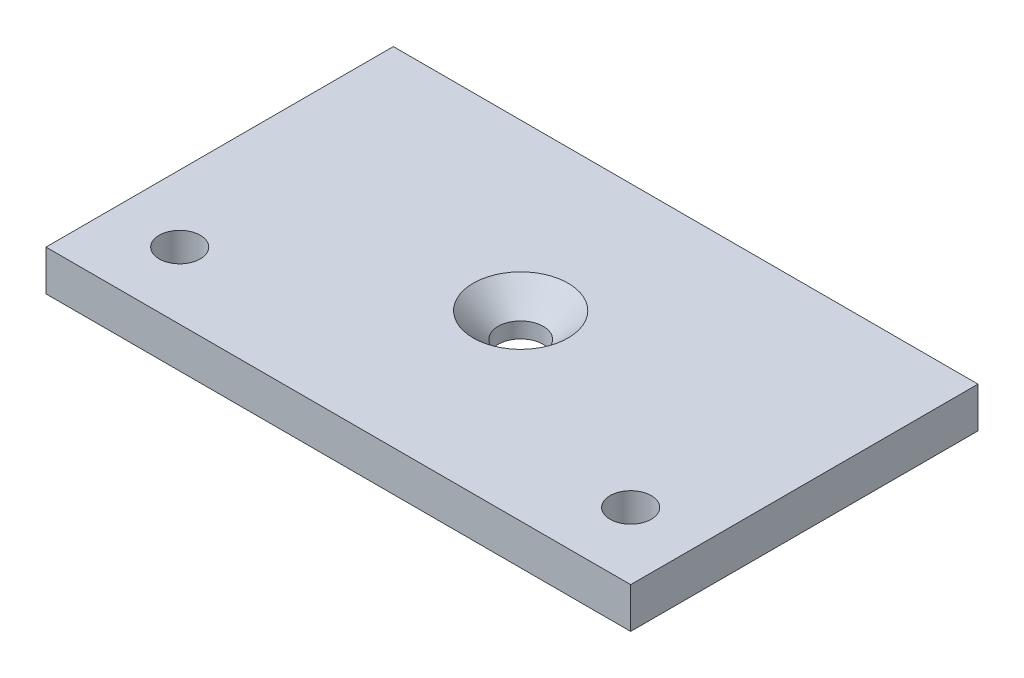
ISO-10303-21;
HEADER;
FILE_DESCRIPTION(('STEP AP214'),'2;1');
FILE_NAME('part.step','',(''),(''),'','','');
FILE_SCHEMA(('AUTOMOTIVE_DESIGN { 1 0 10303 214 1 1 1 1 }'));
ENDSEC;
DATA;
#1=APPLICATION_CONTEXT('core data for automotive mechanical design processes');
#2=APPLICATION_PROTOCOL_DEFINITION('international standard','automotive_design',2000,#1);
#3=PRODUCT_CONTEXT('',#1,'mechanical');
#4=PRODUCT('Part','Part','',(#3));
#5=PRODUCT_RELATED_PRODUCT_CATEGORY('part','',(#4));
#6=PRODUCT_DEFINITION_FORMATION('','',#4);
#7=PRODUCT_DEFINITION_CONTEXT('part definition',#1,'design');
#8=PRODUCT_DEFINITION('design','',#6,#7);
#9=PRODUCT_DEFINITION_SHAPE('','',#8);
#10=(LENGTH_UNIT() NAMED_UNIT(*) SI_UNIT(.MILLI.,.METRE.));
#11=(NAMED_UNIT(*) PLANE_ANGLE_UNIT() SI_UNIT($,.RADIAN.));
#12=(NAMED_UNIT(*) SI_UNIT($,.STERADIAN.) SOLID_ANGLE_UNIT());
#13=UNCERTAINTY_MEASURE_WITH_UNIT(LENGTH_MEASURE(1.E-05),#10,'distance_accuracy_value','');
#14=(GEOMETRIC_REPRESENTATION_CONTEXT(3) GLOBAL_UNCERTAINTY_ASSIGNED_CONTEXT((#13)) GLOBAL_UNIT_ASSIGNED_CONTEXT((#10,
#11,#12)) REPRESENTATION_CONTEXT('',''));
#15=CARTESIAN_POINT('',(0.,0.,0.));
#16=DIRECTION('',(0.,0.,1.));
#17=DIRECTION('',(1.,0.,0.));
#18=AXIS2_PLACEMENT_3D('',#15,#16,#17);
#19=CARTESIAN_POINT('',(0.,0.,-4.25));
#20=DIRECTION('',(0.,0.,1.));
#21=DIRECTION('',(1.,0.,0.));
#22=AXIS2_PLACEMENT_3D('',#19,#20,#21);
#23=PLANE('',#22);
#24=DIRECTION('',(1.,0.,0.));
#25=VECTOR('',#24,1.);
#26=CARTESIAN_POINT('',(0.,3.5,-4.25));
#27=LINE('',#26,#25);
#28=CARTESIAN_POINT('',(-25.25,3.5,-4.25));
#29=VERTEX_POINT('',#28);
#30=CARTESIAN_POINT('',(25.25,3.5,-4.25));
#31=VERTEX_POINT('',#30);
#32=EDGE_CURVE('E11',#29,#31,#27,.T.);
#33=ORIENTED_EDGE('',*,*,#32,.T.);
#34=DIRECTION('',(0.,1.,0.));
#35=VECTOR('',#34,1.);
#36=CARTESIAN_POINT('',(25.25,3.5,-4.25));
#37=LINE('',#36,#35);
#38=CARTESIAN_POINT('',(25.25,0.,-4.25));
#39=VERTEX_POINT('',#38);
#40=EDGE_CURVE('E48',#39,#31,#37,.T.);
#41=ORIENTED_EDGE('',*,*,#40,.F.);
#42=DIRECTION('',(1.,0.,0.));
#43=VECTOR('',#42,1.);
#44=CARTESIAN_POINT('',(0.,0.,-4.25));
#45=LINE('',#44,#43);
#46=CARTESIAN_POINT('',(-25.25,0.,-4.25));
#47=VERTEX_POINT('',#46);
#48=EDGE_CURVE('E93',#47,#39,#45,.T.);
#49=ORIENTED_EDGE('',*,*,#48,.F.);
#50=DIRECTION('',(0.,1.,0.));
#51=VECTOR('',#50,1.);
#52=CARTESIAN_POINT('',(-25.25,3.5,-4.25));
#53=LINE('',#52,#51);
#54=EDGE_CURVE('E41',#47,#29,#53,.T.);
#55=ORIENTED_EDGE('',*,*,#54,.T.);
#56=EDGE_LOOP('',(#33,#41,#49,#55));
#57=FACE_BOUND('',#56,.T.);
#58=ADVANCED_FACE('F34',(#57),#23,.F.);
#59=CARTESIAN_POINT('',(0.,3.5,10.));
#60=DIRECTION('',(0.,1.,0.));
#61=DIRECTION('',(0.,0.,1.));
#62=AXIS2_PLACEMENT_3D('',#59,#60,#61);
#63=CONICAL_SURFACE('',#62,4.1,0.785398163397448);
#64=CARTESIAN_POINT('',(0.,1.35,10.));
#65=DIRECTION('',(0.,1.,0.));
#66=DIRECTION('',(0.,0.,1.));
#67=AXIS2_PLACEMENT_3D('',#64,#65,#66);
#68=CIRCLE('',#67,1.95);
#69=CARTESIAN_POINT('',(0.,1.35,11.95));
#70=VERTEX_POINT('',#69);
#71=EDGE_CURVE('E121',#70,#70,#68,.T.);
#72=ORIENTED_EDGE('',*,*,#71,.F.);
#73=EDGE_LOOP('',(#72));
#74=FACE_BOUND('',#73,.T.);
#75=CARTESIAN_POINT('',(0.,3.5,10.));
#76=DIRECTION('',(0.,1.,0.));
#77=DIRECTION('',(0.,0.,1.));
#78=AXIS2_PLACEMENT_3D('',#75,#76,#77);
#79=CIRCLE('',#78,4.1);
#80=CARTESIAN_POINT('',(0.,3.5,14.1));
#81=VERTEX_POINT('',#80);
#82=EDGE_CURVE('E124',#81,#81,#79,.T.);
#83=ORIENTED_EDGE('',*,*,#82,.T.);
#84=EDGE_LOOP('',(#83));
#85=FACE_BOUND('',#84,.T.);
#86=ADVANCED_FACE('F128',(#74,#85),#63,.F.);
#87=CARTESIAN_POINT('',(0.,3.5,25.75));
#88=DIRECTION('',(0.,0.,-1.));
#89=DIRECTION('',(-1.,0.,0.));
#90=AXIS2_PLACEMENT_3D('',#87,#88,#89);
#91=PLANE('',#90);
#92=DIRECTION('',(1.,0.,0.));
#93=VECTOR('',#92,1.);
#94=CARTESIAN_POINT('',(0.,0.,25.75));
#95=LINE('',#94,#93);
#96=CARTESIAN_POINT('',(-25.25,0.,25.75));
#97=VERTEX_POINT('',#96);
#98=CARTESIAN_POINT('',(25.25,0.,25.75));
#99=VERTEX_POINT('',#98);
#100=EDGE_CURVE('E92',#97,#99,#95,.T.);
#101=ORIENTED_EDGE('',*,*,#100,.T.);
#102=DIRECTION('',(0.,-1.,0.));
#103=VECTOR('',#102,1.);
#104=CARTESIAN_POINT('',(25.25,3.5,25.75));
#105=LINE('',#104,#103);
#106=CARTESIAN_POINT('',(25.25,3.5,25.75));
#107=VERTEX_POINT('',#106);
#108=EDGE_CURVE('E76',#107,#99,#105,.T.);
#109=ORIENTED_EDGE('',*,*,#108,.F.);
#110=DIRECTION('',(1.,0.,0.));
#111=VECTOR('',#110,1.);
#112=CARTESIAN_POINT('',(0.,3.5,25.75));
#113=LINE('',#112,#111);
#114=CARTESIAN_POINT('',(-25.25,3.5,25.75));
#115=VERTEX_POINT('',#114);
#116=EDGE_CURVE('E80',#115,#107,#113,.T.);
#117=ORIENTED_EDGE('',*,*,#116,.F.);
#118=DIRECTION('',(0.,-1.,0.));
#119=VECTOR('',#118,1.);
#120=CARTESIAN_POINT('',(-25.25,3.5,25.75));
#121=LINE('',#120,#119);
#122=EDGE_CURVE('E94',#115,#97,#121,.T.);
#123=ORIENTED_EDGE('',*,*,#122,.T.);
#124=EDGE_LOOP('',(#101,#109,#117,#123));
#125=FACE_BOUND('',#124,.T.);
#126=ADVANCED_FACE('F90',(#125),#91,.F.);
#127=CARTESIAN_POINT('',(25.25,3.5,0.));
#128=DIRECTION('',(-1.,0.,0.));
#129=DIRECTION('',(0.,0.,1.));
#130=AXIS2_PLACEMENT_3D('',#127,#128,#129);
#131=PLANE('',#130);
#132=DIRECTION('',(0.,0.,-1.));
#133=VECTOR('',#132,1.);
#134=CARTESIAN_POINT('',(25.25,0.,0.));
#135=LINE('',#134,#133);
#136=EDGE_CURVE('E104',#99,#39,#135,.T.);
#137=ORIENTED_EDGE('',*,*,#136,.T.);
#138=ORIENTED_EDGE('',*,*,#40,.T.);
#139=DIRECTION('',(0.,0.,-1.));
#140=VECTOR('',#139,1.);
#141=CARTESIAN_POINT('',(25.25,3.5,0.));
#142=LINE('',#141,#140);
#143=EDGE_CURVE('E72',#107,#31,#142,.T.);
#144=ORIENTED_EDGE('',*,*,#143,.F.);
#145=ORIENTED_EDGE('',*,*,#108,.T.);
#146=EDGE_LOOP('',(#137,#138,#144,#145));
#147=FACE_BOUND('',#146,.T.);
#148=ADVANCED_FACE('F74',(#147),#131,.F.);
#149=CARTESIAN_POINT('',(-25.25,3.5,0.));
#150=DIRECTION('',(-1.,0.,0.));
#151=DIRECTION('',(0.,0.,1.));
#152=AXIS2_PLACEMENT_3D('',#149,#150,#151);
#153=PLANE('',#152);
#154=ORIENTED_EDGE('',*,*,#54,.F.);
#155=DIRECTION('',(0.,0.,-1.));
#156=VECTOR('',#155,1.);
#157=CARTESIAN_POINT('',(-25.25,0.,0.));
#158=LINE('',#157,#156);
#159=EDGE_CURVE('E100',#97,#47,#158,.T.);
#160=ORIENTED_EDGE('',*,*,#159,.F.);
#161=ORIENTED_EDGE('',*,*,#122,.F.);
#162=DIRECTION('',(0.,0.,-1.));
#163=VECTOR('',#162,1.);
#164=CARTESIAN_POINT('',(-25.25,3.5,0.));
#165=LINE('',#164,#163);
#166=EDGE_CURVE('E79',#115,#29,#165,.T.);
#167=ORIENTED_EDGE('',*,*,#166,.T.);
#168=EDGE_LOOP('',(#154,#160,#161,#167));
#169=FACE_BOUND('',#168,.T.);
#170=ADVANCED_FACE('F141',(#169),#153,.T.);
#171=CARTESIAN_POINT('',(19.475,3.5,19.975));
#172=DIRECTION('',(0.,-1.,0.));
#173=DIRECTION('',(0.,0.,-1.));
#174=AXIS2_PLACEMENT_3D('',#171,#172,#173);
#175=CYLINDRICAL_SURFACE('',#174,1.775);
#176=CARTESIAN_POINT('',(19.475,3.5,19.975));
#177=DIRECTION('',(0.,1.,0.));
#178=DIRECTION('',(0.,0.,1.));
#179=AXIS2_PLACEMENT_3D('',#176,#177,#178);
#180=CIRCLE('',#179,1.775);
#181=CARTESIAN_POINT('',(19.475,3.5,21.75));
#182=VERTEX_POINT('',#181);
#183=EDGE_CURVE('E88',#182,#182,#180,.T.);
#184=ORIENTED_EDGE('',*,*,#183,.T.);
#185=EDGE_LOOP('',(#184));
#186=FACE_BOUND('',#185,.T.);
#187=CARTESIAN_POINT('',(19.475,0.,19.975));
#188=DIRECTION('',(0.,1.,0.));
#189=DIRECTION('',(0.,0.,1.));
#190=AXIS2_PLACEMENT_3D('',#187,#188,#189);
#191=CIRCLE('',#190,1.775);
#192=CARTESIAN_POINT('',(19.475,0.,21.75));
#193=VERTEX_POINT('',#192);
#194=EDGE_CURVE('E107',#193,#193,#191,.T.);
#195=ORIENTED_EDGE('',*,*,#194,.F.);
#196=EDGE_LOOP('',(#195));
#197=FACE_BOUND('',#196,.T.);
#198=ADVANCED_FACE('F137',(#186,#197),#175,.F.);
#199=CARTESIAN_POINT('',(-19.475,3.5,19.975));
#200=DIRECTION('',(0.,-1.,0.));
#201=DIRECTION('',(0.,0.,-1.));
#202=AXIS2_PLACEMENT_3D('',#199,#200,#201);
#203=CYLINDRICAL_SURFACE('',#202,1.775);
#204=CARTESIAN_POINT('',(-19.475,3.5,19.975));
#205=DIRECTION('',(0.,1.,0.));
#206=DIRECTION('',(0.,0.,1.));
#207=AXIS2_PLACEMENT_3D('',#204,#205,#206);
#208=CIRCLE('',#207,1.775);
#209=CARTESIAN_POINT('',(-19.475,3.5,21.75));
#210=VERTEX_POINT('',#209);
#211=EDGE_CURVE('E103',#210,#210,#208,.T.);
#212=ORIENTED_EDGE('',*,*,#211,.T.);
#213=EDGE_LOOP('',(#212));
#214=FACE_BOUND('',#213,.T.);
#215=CARTESIAN_POINT('',(-19.475,0.,19.975));
#216=DIRECTION('',(0.,1.,0.));
#217=DIRECTION('',(0.,0.,1.));
#218=AXIS2_PLACEMENT_3D('',#215,#216,#217);
#219=CIRCLE('',#218,1.775);
#220=CARTESIAN_POINT('',(-19.475,0.,21.75));
#221=VERTEX_POINT('',#220);
#222=EDGE_CURVE('E110',#221,#221,#219,.T.);
#223=ORIENTED_EDGE('',*,*,#222,.F.);
#224=EDGE_LOOP('',(#223));
#225=FACE_BOUND('',#224,.T.);
#226=ADVANCED_FACE('F140',(#214,#225),#203,.F.);
#227=CARTESIAN_POINT('',(0.,3.5,10.));
#228=DIRECTION('',(0.,1.,0.));
#229=DIRECTION('',(0.,0.,1.));
#230=AXIS2_PLACEMENT_3D('',#227,#228,#229);
#231=CYLINDRICAL_SURFACE('',#230,1.95);
#232=CARTESIAN_POINT('',(0.,0.,10.));
#233=DIRECTION('',(0.,1.,0.));
#234=DIRECTION('',(0.,0.,1.));
#235=AXIS2_PLACEMENT_3D('',#232,#233,#234);
#236=CIRCLE('',#235,1.95);
#237=CARTESIAN_POINT('',(0.,0.,11.95));
#238=VERTEX_POINT('',#237);
#239=EDGE_CURVE('E113',#238,#238,#236,.T.);
#240=ORIENTED_EDGE('',*,*,#239,.F.);
#241=EDGE_LOOP('',(#240));
#242=FACE_BOUND('',#241,.T.);
#243=ORIENTED_EDGE('',*,*,#71,.T.);
#244=EDGE_LOOP('',(#243));
#245=FACE_BOUND('',#244,.T.);
#246=ADVANCED_FACE('F147',(#242,#245),#231,.F.);
#247=CARTESIAN_POINT('',(0.,0.,0.));
#248=DIRECTION('',(0.,1.,0.));
#249=DIRECTION('',(0.,0.,1.));
#250=AXIS2_PLACEMENT_3D('',#247,#248,#249);
#251=PLANE('',#250);
#252=ORIENTED_EDGE('',*,*,#239,.T.);
#253=EDGE_LOOP('',(#252));
#254=FACE_BOUND('',#253,.T.);
#255=ORIENTED_EDGE('',*,*,#222,.T.);
#256=EDGE_LOOP('',(#255));
#257=FACE_BOUND('',#256,.T.);
#258=ORIENTED_EDGE('',*,*,#194,.T.);
#259=EDGE_LOOP('',(#258));
#260=FACE_BOUND('',#259,.T.);
#261=ORIENTED_EDGE('',*,*,#159,.T.);
#262=ORIENTED_EDGE('',*,*,#48,.T.);
#263=ORIENTED_EDGE('',*,*,#136,.F.);
#264=ORIENTED_EDGE('',*,*,#100,.F.);
#265=EDGE_LOOP('',(#261,#262,#263,#264));
#266=FACE_BOUND('',#265,.T.);
#267=ADVANCED_FACE('F131',(#254,#257,#260,#266),#251,.F.);
#268=CARTESIAN_POINT('',(0.,3.5,0.));
#269=DIRECTION('',(0.,1.,0.));
#270=DIRECTION('',(0.,0.,1.));
#271=AXIS2_PLACEMENT_3D('',#268,#269,#270);
#272=PLANE('',#271);
#273=ORIENTED_EDGE('',*,*,#32,.F.);
#274=ORIENTED_EDGE('',*,*,#166,.F.);
#275=ORIENTED_EDGE('',*,*,#116,.T.);
#276=ORIENTED_EDGE('',*,*,#143,.T.);
#277=EDGE_LOOP('',(#273,#274,#275,#276));
#278=FACE_BOUND('',#277,.T.);
#279=ORIENTED_EDGE('',*,*,#82,.F.);
#280=EDGE_LOOP('',(#279));
#281=FACE_BOUND('',#280,.T.);
#282=ORIENTED_EDGE('',*,*,#211,.F.);
#283=EDGE_LOOP('',(#282));
#284=FACE_BOUND('',#283,.T.);
#285=ORIENTED_EDGE('',*,*,#183,.F.);
#286=EDGE_LOOP('',(#285));
#287=FACE_BOUND('',#286,.T.);
#288=ADVANCED_FACE('F84',(#278,#281,#284,#287),#272,.T.);
#289=CLOSED_SHELL('',(#58,#86,#126,#148,#170,#198,#226,#246,#267,#288));
#290=MANIFOLD_SOLID_BREP('B2',#289);
#291=ADVANCED_BREP_SHAPE_REPRESENTATION('',(#18,#290),#14);
#292=SHAPE_DEFINITION_REPRESENTATION(#9,#291);
ENDSEC;
END-ISO-10303-21;
